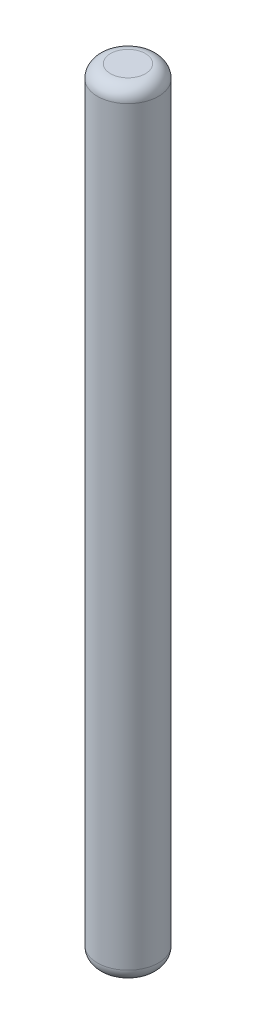
ISO-10303-21;
HEADER;
FILE_DESCRIPTION(('STEP AP214'),'2;1');
FILE_NAME('part.step','',(''),(''),'','','');
FILE_SCHEMA(('AUTOMOTIVE_DESIGN { 1 0 10303 214 1 1 1 1 }'));
ENDSEC;
DATA;
#1=APPLICATION_CONTEXT('core data for automotive mechanical design processes');
#2=APPLICATION_PROTOCOL_DEFINITION('international standard','automotive_design',2000,#1);
#3=PRODUCT_CONTEXT('',#1,'mechanical');
#4=PRODUCT('Part','Part','',(#3));
#5=PRODUCT_RELATED_PRODUCT_CATEGORY('part','',(#4));
#6=PRODUCT_DEFINITION_FORMATION('','',#4);
#7=PRODUCT_DEFINITION_CONTEXT('part definition',#1,'design');
#8=PRODUCT_DEFINITION('design','',#6,#7);
#9=PRODUCT_DEFINITION_SHAPE('','',#8);
#10=(LENGTH_UNIT() NAMED_UNIT(*) SI_UNIT(.MILLI.,.METRE.));
#11=(NAMED_UNIT(*) PLANE_ANGLE_UNIT() SI_UNIT($,.RADIAN.));
#12=(NAMED_UNIT(*) SI_UNIT($,.STERADIAN.) SOLID_ANGLE_UNIT());
#13=UNCERTAINTY_MEASURE_WITH_UNIT(LENGTH_MEASURE(1.E-05),#10,'distance_accuracy_value','');
#14=(GEOMETRIC_REPRESENTATION_CONTEXT(3) GLOBAL_UNCERTAINTY_ASSIGNED_CONTEXT((#13)) GLOBAL_UNIT_ASSIGNED_CONTEXT((#10,
#11,#12)) REPRESENTATION_CONTEXT('',''));
#15=CARTESIAN_POINT('',(0.,0.,0.));
#16=DIRECTION('',(0.,0.,1.));
#17=DIRECTION('',(1.,0.,0.));
#18=AXIS2_PLACEMENT_3D('',#15,#16,#17);
#19=CARTESIAN_POINT('',(0.,8.9,0.));
#20=DIRECTION('',(0.,-1.,0.));
#21=DIRECTION('',(0.,0.,-1.));
#22=AXIS2_PLACEMENT_3D('',#19,#20,#21);
#23=CYLINDRICAL_SURFACE('',#22,0.35);
#24=CARTESIAN_POINT('',(0.,0.150000000000001,0.));
#25=DIRECTION('',(0.,1.,0.));
#26=DIRECTION('',(0.,0.,1.));
#27=AXIS2_PLACEMENT_3D('',#24,#25,#26);
#28=CIRCLE('',#27,0.35);
#29=CARTESIAN_POINT('',(0.,0.150000000000001,0.35));
#30=VERTEX_POINT('',#29);
#31=EDGE_CURVE('E41',#30,#30,#28,.T.);
#32=ORIENTED_EDGE('',*,*,#31,.T.);
#33=EDGE_LOOP('',(#32));
#34=FACE_BOUND('',#33,.T.);
#35=CARTESIAN_POINT('',(0.,8.75,0.));
#36=DIRECTION('',(0.,1.,0.));
#37=DIRECTION('',(0.,0.,1.));
#38=AXIS2_PLACEMENT_3D('',#35,#36,#37);
#39=CIRCLE('',#38,0.35);
#40=CARTESIAN_POINT('',(0.,8.75,0.35));
#41=VERTEX_POINT('',#40);
#42=EDGE_CURVE('E45',#41,#41,#39,.F.);
#43=ORIENTED_EDGE('',*,*,#42,.T.);
#44=EDGE_LOOP('',(#43));
#45=FACE_BOUND('',#44,.T.);
#46=ADVANCED_FACE('F30',(#34,#45),#23,.T.);
#47=CARTESIAN_POINT('',(0.,8.9,0.));
#48=DIRECTION('',(0.,1.,0.));
#49=DIRECTION('',(0.,0.,1.));
#50=AXIS2_PLACEMENT_3D('',#47,#48,#49);
#51=PLANE('',#50);
#52=CARTESIAN_POINT('',(0.,8.9,0.));
#53=DIRECTION('',(0.,1.,0.));
#54=DIRECTION('',(0.,0.,1.));
#55=AXIS2_PLACEMENT_3D('',#52,#53,#54);
#56=CIRCLE('',#55,0.2);
#57=CARTESIAN_POINT('',(0.,8.9,0.2));
#58=VERTEX_POINT('',#57);
#59=EDGE_CURVE('E10',#58,#58,#56,.T.);
#60=ORIENTED_EDGE('',*,*,#59,.T.);
#61=EDGE_LOOP('',(#60));
#62=FACE_BOUND('',#61,.T.);
#63=ADVANCED_FACE('F61',(#62),#51,.T.);
#64=CARTESIAN_POINT('',(0.,0.,0.));
#65=DIRECTION('',(0.,1.,0.));
#66=DIRECTION('',(0.,0.,1.));
#67=AXIS2_PLACEMENT_3D('',#64,#65,#66);
#68=PLANE('',#67);
#69=CARTESIAN_POINT('',(0.,0.,0.));
#70=DIRECTION('',(0.,1.,0.));
#71=DIRECTION('',(0.,0.,1.));
#72=AXIS2_PLACEMENT_3D('',#69,#70,#71);
#73=CIRCLE('',#72,0.2);
#74=CARTESIAN_POINT('',(0.,0.,0.2));
#75=VERTEX_POINT('',#74);
#76=EDGE_CURVE('E37',#75,#75,#73,.F.);
#77=ORIENTED_EDGE('',*,*,#76,.T.);
#78=EDGE_LOOP('',(#77));
#79=FACE_BOUND('',#78,.T.);
#80=ADVANCED_FACE('F58',(#79),#68,.F.);
#81=CARTESIAN_POINT('',(0.,0.150000000000001,0.));
#82=DIRECTION('',(0.,1.,0.));
#83=DIRECTION('',(0.,0.,1.));
#84=AXIS2_PLACEMENT_3D('',#81,#82,#83);
#85=TOROIDAL_SURFACE('',#84,0.2,0.15);
#86=ORIENTED_EDGE('',*,*,#76,.F.);
#87=EDGE_LOOP('',(#86));
#88=FACE_BOUND('',#87,.T.);
#89=ORIENTED_EDGE('',*,*,#31,.F.);
#90=EDGE_LOOP('',(#89));
#91=FACE_BOUND('',#90,.T.);
#92=ADVANCED_FACE('F54',(#88,#91),#85,.T.);
#93=CARTESIAN_POINT('',(0.,8.75,0.));
#94=DIRECTION('',(0.,1.,0.));
#95=DIRECTION('',(0.,0.,1.));
#96=AXIS2_PLACEMENT_3D('',#93,#94,#95);
#97=TOROIDAL_SURFACE('',#96,0.2,0.15);
#98=ORIENTED_EDGE('',*,*,#42,.F.);
#99=EDGE_LOOP('',(#98));
#100=FACE_BOUND('',#99,.T.);
#101=ORIENTED_EDGE('',*,*,#59,.F.);
#102=EDGE_LOOP('',(#101));
#103=FACE_BOUND('',#102,.T.);
#104=ADVANCED_FACE('F32',(#100,#103),#97,.T.);
#105=CLOSED_SHELL('',(#46,#63,#80,#92,#104));
#106=MANIFOLD_SOLID_BREP('B2',#105);
#107=ADVANCED_BREP_SHAPE_REPRESENTATION('',(#18,#106),#14);
#108=SHAPE_DEFINITION_REPRESENTATION(#9,#107);
ENDSEC;
END-ISO-10303-21;
